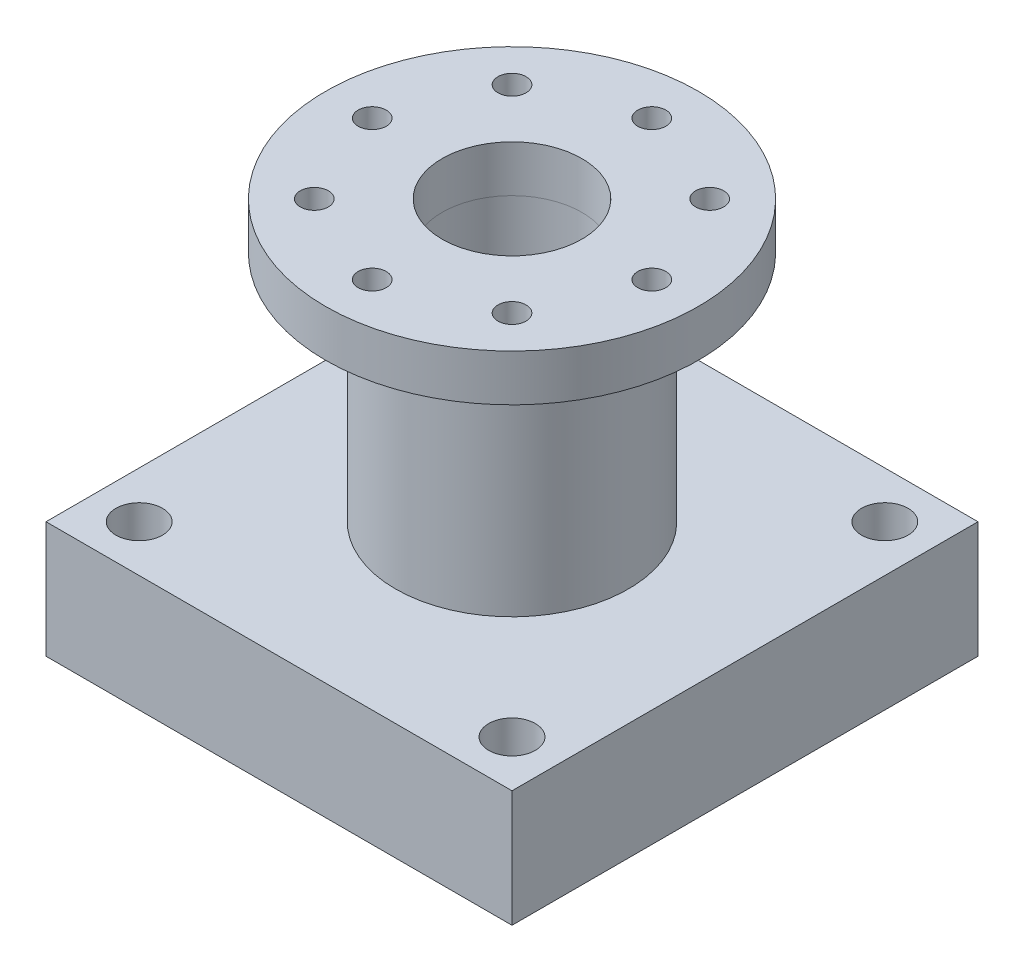
ISO-10303-21;
HEADER;
FILE_DESCRIPTION(('STEP AP214'),'2;1');
FILE_NAME('part.step','',(''),(''),'','','');
FILE_SCHEMA(('AUTOMOTIVE_DESIGN { 1 0 10303 214 1 1 1 1 }'));
ENDSEC;
DATA;
#1=APPLICATION_CONTEXT('core data for automotive mechanical design processes');
#2=APPLICATION_PROTOCOL_DEFINITION('international standard','automotive_design',2000,#1);
#3=PRODUCT_CONTEXT('',#1,'mechanical');
#4=PRODUCT('Part','Part','',(#3));
#5=PRODUCT_RELATED_PRODUCT_CATEGORY('part','',(#4));
#6=PRODUCT_DEFINITION_FORMATION('','',#4);
#7=PRODUCT_DEFINITION_CONTEXT('part definition',#1,'design');
#8=PRODUCT_DEFINITION('design','',#6,#7);
#9=PRODUCT_DEFINITION_SHAPE('','',#8);
#10=(LENGTH_UNIT() NAMED_UNIT(*) SI_UNIT(.MILLI.,.METRE.));
#11=(NAMED_UNIT(*) PLANE_ANGLE_UNIT() SI_UNIT($,.RADIAN.));
#12=(NAMED_UNIT(*) SI_UNIT($,.STERADIAN.) SOLID_ANGLE_UNIT());
#13=UNCERTAINTY_MEASURE_WITH_UNIT(LENGTH_MEASURE(1.E-05),#10,'distance_accuracy_value','');
#14=(GEOMETRIC_REPRESENTATION_CONTEXT(3) GLOBAL_UNCERTAINTY_ASSIGNED_CONTEXT((#13)) GLOBAL_UNIT_ASSIGNED_CONTEXT((#10,
#11,#12)) REPRESENTATION_CONTEXT('',''));
#15=CARTESIAN_POINT('',(0.,0.,0.));
#16=DIRECTION('',(0.,0.,1.));
#17=DIRECTION('',(1.,0.,0.));
#18=AXIS2_PLACEMENT_3D('',#15,#16,#17);
#19=CARTESIAN_POINT('',(0.,60.,0.));
#20=DIRECTION('',(0.,1.,0.));
#21=DIRECTION('',(0.,0.,1.));
#22=AXIS2_PLACEMENT_3D('',#19,#20,#21);
#23=PLANE('',#22);
#24=CARTESIAN_POINT('',(-21.2132034355962,60.,-21.2132034355967));
#25=DIRECTION('',(0.,1.,0.));
#26=DIRECTION('',(0.707106781186539,0.,0.707106781186556));
#27=AXIS2_PLACEMENT_3D('',#24,#25,#26);
#28=CIRCLE('',#27,3.01435233277966);
#29=CARTESIAN_POINT('',(-19.0817344602022,60.,-19.0817344602027));
#30=VERTEX_POINT('',#29);
#31=EDGE_CURVE('E103',#30,#30,#28,.T.);
#32=ORIENTED_EDGE('',*,*,#31,.F.);
#33=EDGE_LOOP('',(#32));
#34=FACE_BOUND('',#33,.T.);
#35=CARTESIAN_POINT('',(-30.,60.,-3.14233320495882E-13));
#36=DIRECTION('',(0.,1.,0.));
#37=DIRECTION('',(1.,0.,0.));
#38=AXIS2_PLACEMENT_3D('',#35,#36,#37);
#39=CIRCLE('',#38,3.01435233277966);
#40=CARTESIAN_POINT('',(-26.9856476672203,60.,-2.82659655740087E-13));
#41=VERTEX_POINT('',#40);
#42=EDGE_CURVE('E97',#41,#41,#39,.T.);
#43=ORIENTED_EDGE('',*,*,#42,.F.);
#44=EDGE_LOOP('',(#43));
#45=FACE_BOUND('',#44,.T.);
#46=CARTESIAN_POINT('',(-21.2132034355966,60.,21.2132034355962));
#47=DIRECTION('',(0.,1.,0.));
#48=DIRECTION('',(0.707106781186554,0.,-0.707106781186541));
#49=AXIS2_PLACEMENT_3D('',#46,#47,#48);
#50=CIRCLE('',#49,3.01435233277966);
#51=CARTESIAN_POINT('',(-19.0817344602026,60.,19.0817344602023));
#52=VERTEX_POINT('',#51);
#53=EDGE_CURVE('E91',#52,#52,#50,.T.);
#54=ORIENTED_EDGE('',*,*,#53,.F.);
#55=EDGE_LOOP('',(#54));
#56=FACE_BOUND('',#55,.T.);
#57=CARTESIAN_POINT('',(0.,60.,30.));
#58=DIRECTION('',(0.,1.,0.));
#59=DIRECTION('',(0.,0.,-1.));
#60=AXIS2_PLACEMENT_3D('',#57,#58,#59);
#61=CIRCLE('',#60,3.01435233277966);
#62=CARTESIAN_POINT('',(0.,60.,26.9856476672203));
#63=VERTEX_POINT('',#62);
#64=EDGE_CURVE('E85',#63,#63,#61,.T.);
#65=ORIENTED_EDGE('',*,*,#64,.F.);
#66=EDGE_LOOP('',(#65));
#67=FACE_BOUND('',#66,.T.);
#68=CARTESIAN_POINT('',(21.2132034355963,60.,21.2132034355965));
#69=DIRECTION('',(0.,1.,0.));
#70=DIRECTION('',(-0.707106781186544,0.,-0.707106781186551));
#71=AXIS2_PLACEMENT_3D('',#68,#69,#70);
#72=CIRCLE('',#71,3.01435233277966);
#73=CARTESIAN_POINT('',(19.0817344602023,60.,19.0817344602025));
#74=VERTEX_POINT('',#73);
#75=EDGE_CURVE('E79',#74,#74,#72,.T.);
#76=ORIENTED_EDGE('',*,*,#75,.F.);
#77=EDGE_LOOP('',(#76));
#78=FACE_BOUND('',#77,.T.);
#79=CARTESIAN_POINT('',(30.,60.,1.04744440165294E-13));
#80=DIRECTION('',(0.,1.,0.));
#81=DIRECTION('',(-1.,0.,0.));
#82=AXIS2_PLACEMENT_3D('',#79,#80,#81);
#83=CIRCLE('',#82,3.01435233277966);
#84=CARTESIAN_POINT('',(26.9856476672203,60.,0.));
#85=VERTEX_POINT('',#84);
#86=EDGE_CURVE('E73',#85,#85,#83,.T.);
#87=ORIENTED_EDGE('',*,*,#86,.F.);
#88=EDGE_LOOP('',(#87));
#89=FACE_BOUND('',#88,.T.);
#90=CARTESIAN_POINT('',(21.2132034355965,60.,-21.2132034355964));
#91=DIRECTION('',(0.,1.,0.));
#92=DIRECTION('',(-0.707106781186549,0.,0.707106781186546));
#93=AXIS2_PLACEMENT_3D('',#90,#91,#92);
#94=CIRCLE('',#93,3.01435233277966);
#95=CARTESIAN_POINT('',(19.0817344602025,60.,-19.0817344602024));
#96=VERTEX_POINT('',#95);
#97=EDGE_CURVE('E67',#96,#96,#94,.T.);
#98=ORIENTED_EDGE('',*,*,#97,.F.);
#99=EDGE_LOOP('',(#98));
#100=FACE_BOUND('',#99,.T.);
#101=CARTESIAN_POINT('',(0.,60.,-30.));
#102=DIRECTION('',(0.,1.,0.));
#103=DIRECTION('',(0.,0.,1.));
#104=AXIS2_PLACEMENT_3D('',#101,#102,#103);
#105=CIRCLE('',#104,3.01435233277966);
#106=CARTESIAN_POINT('',(0.,60.,-26.9856476672203));
#107=VERTEX_POINT('',#106);
#108=EDGE_CURVE('E61',#107,#107,#105,.T.);
#109=ORIENTED_EDGE('',*,*,#108,.F.);
#110=EDGE_LOOP('',(#109));
#111=FACE_BOUND('',#110,.T.);
#112=CARTESIAN_POINT('',(0.,60.,0.));
#113=DIRECTION('',(0.,1.,0.));
#114=DIRECTION('',(0.,0.,1.));
#115=AXIS2_PLACEMENT_3D('',#112,#113,#114);
#116=CIRCLE('',#115,40.);
#117=CARTESIAN_POINT('',(0.,60.,40.));
#118=VERTEX_POINT('',#117);
#119=EDGE_CURVE('E11',#118,#118,#116,.T.);
#120=ORIENTED_EDGE('',*,*,#119,.T.);
#121=EDGE_LOOP('',(#120));
#122=FACE_BOUND('',#121,.T.);
#123=CARTESIAN_POINT('',(0.,60.,0.));
#124=DIRECTION('',(0.,1.,0.));
#125=DIRECTION('',(0.,0.,1.));
#126=AXIS2_PLACEMENT_3D('',#123,#124,#125);
#127=CIRCLE('',#126,15.);
#128=CARTESIAN_POINT('',(0.,60.,15.));
#129=VERTEX_POINT('',#128);
#130=EDGE_CURVE('E51',#129,#129,#127,.T.);
#131=ORIENTED_EDGE('',*,*,#130,.F.);
#132=EDGE_LOOP('',(#131));
#133=FACE_BOUND('',#132,.T.);
#134=ADVANCED_FACE('F40',(#34,#45,#56,#67,#78,#89,#100,#111,#122,#133),#23,.T.);
#135=CARTESIAN_POINT('',(0.,50.,0.));
#136=DIRECTION('',(0.,1.,0.));
#137=DIRECTION('',(0.,0.,1.));
#138=AXIS2_PLACEMENT_3D('',#135,#136,#137);
#139=PLANE('',#138);
#140=CARTESIAN_POINT('',(-21.2132034355962,50.,-21.2132034355967));
#141=DIRECTION('',(0.,1.,0.));
#142=DIRECTION('',(0.,0.,1.));
#143=AXIS2_PLACEMENT_3D('',#140,#141,#142);
#144=CIRCLE('',#143,3.01435233277966);
#145=CARTESIAN_POINT('',(-21.2132034355962,50.,-18.198851102817));
#146=VERTEX_POINT('',#145);
#147=EDGE_CURVE('E100',#146,#146,#144,.F.);
#148=ORIENTED_EDGE('',*,*,#147,.F.);
#149=EDGE_LOOP('',(#148));
#150=FACE_BOUND('',#149,.T.);
#151=CARTESIAN_POINT('',(-30.,50.,-3.14233320495882E-13));
#152=DIRECTION('',(0.,1.,0.));
#153=DIRECTION('',(0.,0.,1.));
#154=AXIS2_PLACEMENT_3D('',#151,#152,#153);
#155=CIRCLE('',#154,3.01435233277966);
#156=CARTESIAN_POINT('',(-30.,50.,3.01435233277935));
#157=VERTEX_POINT('',#156);
#158=EDGE_CURVE('E94',#157,#157,#155,.F.);
#159=ORIENTED_EDGE('',*,*,#158,.F.);
#160=EDGE_LOOP('',(#159));
#161=FACE_BOUND('',#160,.T.);
#162=CARTESIAN_POINT('',(-21.2132034355966,50.,21.2132034355962));
#163=DIRECTION('',(0.,1.,0.));
#164=DIRECTION('',(0.,0.,1.));
#165=AXIS2_PLACEMENT_3D('',#162,#163,#164);
#166=CIRCLE('',#165,3.01435233277966);
#167=CARTESIAN_POINT('',(-21.2132034355966,50.,24.2275557683759));
#168=VERTEX_POINT('',#167);
#169=EDGE_CURVE('E88',#168,#168,#166,.F.);
#170=ORIENTED_EDGE('',*,*,#169,.F.);
#171=EDGE_LOOP('',(#170));
#172=FACE_BOUND('',#171,.T.);
#173=CARTESIAN_POINT('',(0.,50.,30.));
#174=DIRECTION('',(0.,1.,0.));
#175=DIRECTION('',(0.,0.,1.));
#176=AXIS2_PLACEMENT_3D('',#173,#174,#175);
#177=CIRCLE('',#176,3.01435233277966);
#178=CARTESIAN_POINT('',(0.,50.,33.0143523327797));
#179=VERTEX_POINT('',#178);
#180=EDGE_CURVE('E82',#179,#179,#177,.F.);
#181=ORIENTED_EDGE('',*,*,#180,.F.);
#182=EDGE_LOOP('',(#181));
#183=FACE_BOUND('',#182,.T.);
#184=CARTESIAN_POINT('',(21.2132034355963,50.,21.2132034355965));
#185=DIRECTION('',(0.,1.,0.));
#186=DIRECTION('',(0.,0.,1.));
#187=AXIS2_PLACEMENT_3D('',#184,#185,#186);
#188=CIRCLE('',#187,3.01435233277966);
#189=CARTESIAN_POINT('',(21.2132034355963,50.,24.2275557683762));
#190=VERTEX_POINT('',#189);
#191=EDGE_CURVE('E76',#190,#190,#188,.F.);
#192=ORIENTED_EDGE('',*,*,#191,.F.);
#193=EDGE_LOOP('',(#192));
#194=FACE_BOUND('',#193,.T.);
#195=CARTESIAN_POINT('',(30.,50.,1.04744440165294E-13));
#196=DIRECTION('',(0.,1.,0.));
#197=DIRECTION('',(0.,0.,1.));
#198=AXIS2_PLACEMENT_3D('',#195,#196,#197);
#199=CIRCLE('',#198,3.01435233277966);
#200=CARTESIAN_POINT('',(30.,50.,3.01435233277976));
#201=VERTEX_POINT('',#200);
#202=EDGE_CURVE('E70',#201,#201,#199,.F.);
#203=ORIENTED_EDGE('',*,*,#202,.F.);
#204=EDGE_LOOP('',(#203));
#205=FACE_BOUND('',#204,.T.);
#206=CARTESIAN_POINT('',(21.2132034355965,50.,-21.2132034355964));
#207=DIRECTION('',(0.,1.,0.));
#208=DIRECTION('',(0.,0.,1.));
#209=AXIS2_PLACEMENT_3D('',#206,#207,#208);
#210=CIRCLE('',#209,3.01435233277966);
#211=CARTESIAN_POINT('',(21.2132034355965,50.,-18.1988511028167));
#212=VERTEX_POINT('',#211);
#213=EDGE_CURVE('E64',#212,#212,#210,.F.);
#214=ORIENTED_EDGE('',*,*,#213,.F.);
#215=EDGE_LOOP('',(#214));
#216=FACE_BOUND('',#215,.T.);
#217=CARTESIAN_POINT('',(0.,50.,-30.));
#218=DIRECTION('',(0.,1.,0.));
#219=DIRECTION('',(0.,0.,1.));
#220=AXIS2_PLACEMENT_3D('',#217,#218,#219);
#221=CIRCLE('',#220,3.01435233277966);
#222=CARTESIAN_POINT('',(0.,50.,-26.9856476672203));
#223=VERTEX_POINT('',#222);
#224=EDGE_CURVE('E56',#223,#223,#221,.F.);
#225=ORIENTED_EDGE('',*,*,#224,.F.);
#226=EDGE_LOOP('',(#225));
#227=FACE_BOUND('',#226,.T.);
#228=CARTESIAN_POINT('',(0.,50.,0.));
#229=DIRECTION('',(0.,1.,0.));
#230=DIRECTION('',(0.,0.,1.));
#231=AXIS2_PLACEMENT_3D('',#228,#229,#230);
#232=CIRCLE('',#231,40.);
#233=CARTESIAN_POINT('',(0.,50.,40.));
#234=VERTEX_POINT('',#233);
#235=EDGE_CURVE('E44',#234,#234,#232,.T.);
#236=ORIENTED_EDGE('',*,*,#235,.F.);
#237=EDGE_LOOP('',(#236));
#238=FACE_BOUND('',#237,.T.);
#239=CARTESIAN_POINT('',(0.,50.,0.));
#240=DIRECTION('',(0.,1.,0.));
#241=DIRECTION('',(0.,0.,1.));
#242=AXIS2_PLACEMENT_3D('',#239,#240,#241);
#243=CIRCLE('',#242,15.);
#244=CARTESIAN_POINT('',(0.,50.,15.));
#245=VERTEX_POINT('',#244);
#246=EDGE_CURVE('E53',#245,#245,#243,.T.);
#247=ORIENTED_EDGE('',*,*,#246,.T.);
#248=EDGE_LOOP('',(#247));
#249=FACE_BOUND('',#248,.T.);
#250=ADVANCED_FACE('F112',(#150,#161,#172,#183,#194,#205,#216,#227,#238,#249),#139,.F.);
#251=CARTESIAN_POINT('',(0.,60.,0.));
#252=DIRECTION('',(0.,-1.,0.));
#253=DIRECTION('',(0.,0.,-1.));
#254=AXIS2_PLACEMENT_3D('',#251,#252,#253);
#255=CYLINDRICAL_SURFACE('',#254,40.);
#256=ORIENTED_EDGE('',*,*,#119,.F.);
#257=EDGE_LOOP('',(#256));
#258=FACE_BOUND('',#257,.T.);
#259=ORIENTED_EDGE('',*,*,#235,.T.);
#260=EDGE_LOOP('',(#259));
#261=FACE_BOUND('',#260,.T.);
#262=ADVANCED_FACE('F42',(#258,#261),#255,.T.);
#263=CARTESIAN_POINT('',(0.,60.,0.));
#264=DIRECTION('',(0.,-1.,0.));
#265=DIRECTION('',(0.,0.,-1.));
#266=AXIS2_PLACEMENT_3D('',#263,#264,#265);
#267=CYLINDRICAL_SURFACE('',#266,15.);
#268=ORIENTED_EDGE('',*,*,#130,.T.);
#269=EDGE_LOOP('',(#268));
#270=FACE_BOUND('',#269,.T.);
#271=ORIENTED_EDGE('',*,*,#246,.F.);
#272=EDGE_LOOP('',(#271));
#273=FACE_BOUND('',#272,.T.);
#274=ADVANCED_FACE('F130',(#270,#273),#267,.F.);
#275=CARTESIAN_POINT('',(0.,-25.001,-30.));
#276=DIRECTION('',(0.,1.,0.));
#277=DIRECTION('',(0.,0.,1.));
#278=AXIS2_PLACEMENT_3D('',#275,#276,#277);
#279=CYLINDRICAL_SURFACE('',#278,3.01435233277966);
#280=ORIENTED_EDGE('',*,*,#108,.T.);
#281=EDGE_LOOP('',(#280));
#282=FACE_BOUND('',#281,.T.);
#283=ORIENTED_EDGE('',*,*,#224,.T.);
#284=EDGE_LOOP('',(#283));
#285=FACE_BOUND('',#284,.T.);
#286=ADVANCED_FACE('F133',(#282,#285),#279,.F.);
#287=CARTESIAN_POINT('',(21.2132034355965,49.999,-21.2132034355964));
#288=DIRECTION('',(0.,1.,0.));
#289=DIRECTION('',(0.,0.,1.));
#290=AXIS2_PLACEMENT_3D('',#287,#288,#289);
#291=CYLINDRICAL_SURFACE('',#290,3.01435233277966);
#292=ORIENTED_EDGE('',*,*,#97,.T.);
#293=EDGE_LOOP('',(#292));
#294=FACE_BOUND('',#293,.T.);
#295=ORIENTED_EDGE('',*,*,#213,.T.);
#296=EDGE_LOOP('',(#295));
#297=FACE_BOUND('',#296,.T.);
#298=ADVANCED_FACE('F148',(#294,#297),#291,.F.);
#299=CARTESIAN_POINT('',(30.,49.999,1.04744440165294E-13));
#300=DIRECTION('',(0.,1.,0.));
#301=DIRECTION('',(0.,0.,1.));
#302=AXIS2_PLACEMENT_3D('',#299,#300,#301);
#303=CYLINDRICAL_SURFACE('',#302,3.01435233277966);
#304=ORIENTED_EDGE('',*,*,#86,.T.);
#305=EDGE_LOOP('',(#304));
#306=FACE_BOUND('',#305,.T.);
#307=ORIENTED_EDGE('',*,*,#202,.T.);
#308=EDGE_LOOP('',(#307));
#309=FACE_BOUND('',#308,.T.);
#310=ADVANCED_FACE('F152',(#306,#309),#303,.F.);
#311=CARTESIAN_POINT('',(21.2132034355963,49.999,21.2132034355965));
#312=DIRECTION('',(0.,1.,0.));
#313=DIRECTION('',(0.,0.,1.));
#314=AXIS2_PLACEMENT_3D('',#311,#312,#313);
#315=CYLINDRICAL_SURFACE('',#314,3.01435233277966);
#316=ORIENTED_EDGE('',*,*,#75,.T.);
#317=EDGE_LOOP('',(#316));
#318=FACE_BOUND('',#317,.T.);
#319=ORIENTED_EDGE('',*,*,#191,.T.);
#320=EDGE_LOOP('',(#319));
#321=FACE_BOUND('',#320,.T.);
#322=ADVANCED_FACE('F156',(#318,#321),#315,.F.);
#323=CARTESIAN_POINT('',(0.,49.999,30.));
#324=DIRECTION('',(0.,1.,0.));
#325=DIRECTION('',(0.,0.,1.));
#326=AXIS2_PLACEMENT_3D('',#323,#324,#325);
#327=CYLINDRICAL_SURFACE('',#326,3.01435233277966);
#328=ORIENTED_EDGE('',*,*,#64,.T.);
#329=EDGE_LOOP('',(#328));
#330=FACE_BOUND('',#329,.T.);
#331=ORIENTED_EDGE('',*,*,#180,.T.);
#332=EDGE_LOOP('',(#331));
#333=FACE_BOUND('',#332,.T.);
#334=ADVANCED_FACE('F160',(#330,#333),#327,.F.);
#335=CARTESIAN_POINT('',(-21.2132034355966,49.999,21.2132034355962));
#336=DIRECTION('',(0.,1.,0.));
#337=DIRECTION('',(0.,0.,1.));
#338=AXIS2_PLACEMENT_3D('',#335,#336,#337);
#339=CYLINDRICAL_SURFACE('',#338,3.01435233277966);
#340=ORIENTED_EDGE('',*,*,#53,.T.);
#341=EDGE_LOOP('',(#340));
#342=FACE_BOUND('',#341,.T.);
#343=ORIENTED_EDGE('',*,*,#169,.T.);
#344=EDGE_LOOP('',(#343));
#345=FACE_BOUND('',#344,.T.);
#346=ADVANCED_FACE('F164',(#342,#345),#339,.F.);
#347=CARTESIAN_POINT('',(-30.,49.999,-3.14233320495882E-13));
#348=DIRECTION('',(0.,1.,0.));
#349=DIRECTION('',(0.,0.,1.));
#350=AXIS2_PLACEMENT_3D('',#347,#348,#349);
#351=CYLINDRICAL_SURFACE('',#350,3.01435233277966);
#352=ORIENTED_EDGE('',*,*,#42,.T.);
#353=EDGE_LOOP('',(#352));
#354=FACE_BOUND('',#353,.T.);
#355=ORIENTED_EDGE('',*,*,#158,.T.);
#356=EDGE_LOOP('',(#355));
#357=FACE_BOUND('',#356,.T.);
#358=ADVANCED_FACE('F168',(#354,#357),#351,.F.);
#359=CARTESIAN_POINT('',(-21.2132034355962,49.999,-21.2132034355967));
#360=DIRECTION('',(0.,1.,0.));
#361=DIRECTION('',(0.,0.,1.));
#362=AXIS2_PLACEMENT_3D('',#359,#360,#361);
#363=CYLINDRICAL_SURFACE('',#362,3.01435233277966);
#364=ORIENTED_EDGE('',*,*,#31,.T.);
#365=EDGE_LOOP('',(#364));
#366=FACE_BOUND('',#365,.T.);
#367=ORIENTED_EDGE('',*,*,#147,.T.);
#368=EDGE_LOOP('',(#367));
#369=FACE_BOUND('',#368,.T.);
#370=ADVANCED_FACE('F107',(#366,#369),#363,.F.);
#371=CLOSED_SHELL('',(#134,#250,#262,#274,#286,#298,#310,#322,#334,#346,#358,#370));
#372=MANIFOLD_SOLID_BREP('B2',#371);
#373=CARTESIAN_POINT('',(0.,0.,0.));
#374=DIRECTION('',(0.,-1.,0.));
#375=DIRECTION('',(0.,0.,-1.));
#376=AXIS2_PLACEMENT_3D('',#373,#374,#375);
#377=PLANE('',#376);
#378=CARTESIAN_POINT('',(40.,0.,-40.));
#379=DIRECTION('',(0.,-1.,0.));
#380=DIRECTION('',(0.,0.,-1.));
#381=AXIS2_PLACEMENT_3D('',#378,#379,#380);
#382=CIRCLE('',#381,5.);
#383=CARTESIAN_POINT('',(40.,0.,-45.));
#384=VERTEX_POINT('',#383);
#385=EDGE_CURVE('E438',#384,#384,#382,.F.);
#386=ORIENTED_EDGE('',*,*,#385,.F.);
#387=EDGE_LOOP('',(#386));
#388=FACE_BOUND('',#387,.T.);
#389=CARTESIAN_POINT('',(-40.,0.,-40.));
#390=DIRECTION('',(0.,-1.,0.));
#391=DIRECTION('',(0.,0.,-1.));
#392=AXIS2_PLACEMENT_3D('',#389,#390,#391);
#393=CIRCLE('',#392,5.);
#394=CARTESIAN_POINT('',(-40.,0.,-45.));
#395=VERTEX_POINT('',#394);
#396=EDGE_CURVE('E434',#395,#395,#393,.F.);
#397=ORIENTED_EDGE('',*,*,#396,.F.);
#398=EDGE_LOOP('',(#397));
#399=FACE_BOUND('',#398,.T.);
#400=CARTESIAN_POINT('',(40.,0.,40.));
#401=DIRECTION('',(0.,-1.,0.));
#402=DIRECTION('',(0.,0.,-1.));
#403=AXIS2_PLACEMENT_3D('',#400,#401,#402);
#404=CIRCLE('',#403,5.);
#405=CARTESIAN_POINT('',(40.,0.,35.));
#406=VERTEX_POINT('',#405);
#407=EDGE_CURVE('E428',#406,#406,#404,.F.);
#408=ORIENTED_EDGE('',*,*,#407,.F.);
#409=EDGE_LOOP('',(#408));
#410=FACE_BOUND('',#409,.T.);
#411=CARTESIAN_POINT('',(-40.,0.,40.));
#412=DIRECTION('',(0.,-1.,0.));
#413=DIRECTION('',(0.,0.,-1.));
#414=AXIS2_PLACEMENT_3D('',#411,#412,#413);
#415=CIRCLE('',#414,5.);
#416=CARTESIAN_POINT('',(-40.,0.,35.));
#417=VERTEX_POINT('',#416);
#418=EDGE_CURVE('E388',#417,#417,#415,.F.);
#419=ORIENTED_EDGE('',*,*,#418,.F.);
#420=EDGE_LOOP('',(#419));
#421=FACE_BOUND('',#420,.T.);
#422=DIRECTION('',(0.,0.,-1.));
#423=VECTOR('',#422,1.);
#424=CARTESIAN_POINT('',(50.,0.,50.));
#425=LINE('',#424,#423);
#426=CARTESIAN_POINT('',(50.,0.,50.));
#427=VERTEX_POINT('',#426);
#428=CARTESIAN_POINT('',(50.,0.,-50.));
#429=VERTEX_POINT('',#428);
#430=EDGE_CURVE('E338',#427,#429,#425,.T.);
#431=ORIENTED_EDGE('',*,*,#430,.T.);
#432=DIRECTION('',(-1.,0.,0.));
#433=VECTOR('',#432,1.);
#434=CARTESIAN_POINT('',(-50.,0.,-50.));
#435=LINE('',#434,#433);
#436=CARTESIAN_POINT('',(-50.,0.,-50.));
#437=VERTEX_POINT('',#436);
#438=EDGE_CURVE('E341',#429,#437,#435,.T.);
#439=ORIENTED_EDGE('',*,*,#438,.T.);
#440=DIRECTION('',(0.,0.,1.));
#441=VECTOR('',#440,1.);
#442=CARTESIAN_POINT('',(-50.,0.,50.));
#443=LINE('',#442,#441);
#444=CARTESIAN_POINT('',(-50.,0.,50.));
#445=VERTEX_POINT('',#444);
#446=EDGE_CURVE('E322',#437,#445,#443,.T.);
#447=ORIENTED_EDGE('',*,*,#446,.T.);
#448=DIRECTION('',(1.,0.,0.));
#449=VECTOR('',#448,1.);
#450=CARTESIAN_POINT('',(-50.,0.,50.));
#451=LINE('',#450,#449);
#452=EDGE_CURVE('E333',#445,#427,#451,.T.);
#453=ORIENTED_EDGE('',*,*,#452,.T.);
#454=EDGE_LOOP('',(#431,#439,#447,#453));
#455=FACE_BOUND('',#454,.T.);
#456=CARTESIAN_POINT('',(0.,0.,0.));
#457=DIRECTION('',(0.,-1.,0.));
#458=DIRECTION('',(0.,0.,-1.));
#459=AXIS2_PLACEMENT_3D('',#456,#457,#458);
#460=CIRCLE('',#459,25.);
#461=CARTESIAN_POINT('',(0.,0.,-25.));
#462=VERTEX_POINT('',#461);
#463=EDGE_CURVE('E38',#462,#462,#460,.F.);
#464=ORIENTED_EDGE('',*,*,#463,.F.);
#465=EDGE_LOOP('',(#464));
#466=FACE_BOUND('',#465,.T.);
#467=ADVANCED_FACE('F270',(#388,#399,#410,#421,#455,#466),#377,.F.);
#468=CARTESIAN_POINT('',(50.,-25.,50.));
#469=DIRECTION('',(1.,0.,0.));
#470=DIRECTION('',(0.,0.,-1.));
#471=AXIS2_PLACEMENT_3D('',#468,#469,#470);
#472=PLANE('',#471);
#473=ORIENTED_EDGE('',*,*,#430,.F.);
#474=DIRECTION('',(0.,1.,0.));
#475=VECTOR('',#474,1.);
#476=CARTESIAN_POINT('',(50.,-25.,50.));
#477=LINE('',#476,#475);
#478=CARTESIAN_POINT('',(50.,-25.,50.));
#479=VERTEX_POINT('',#478);
#480=EDGE_CURVE('E279',#479,#427,#477,.T.);
#481=ORIENTED_EDGE('',*,*,#480,.F.);
#482=DIRECTION('',(0.,0.,-1.));
#483=VECTOR('',#482,1.);
#484=CARTESIAN_POINT('',(50.,-25.,50.));
#485=LINE('',#484,#483);
#486=CARTESIAN_POINT('',(50.,-25.,-50.));
#487=VERTEX_POINT('',#486);
#488=EDGE_CURVE('E331',#479,#487,#485,.T.);
#489=ORIENTED_EDGE('',*,*,#488,.T.);
#490=DIRECTION('',(0.,1.,0.));
#491=VECTOR('',#490,1.);
#492=CARTESIAN_POINT('',(50.,-25.,-50.));
#493=LINE('',#492,#491);
#494=EDGE_CURVE('E314',#487,#429,#493,.T.);
#495=ORIENTED_EDGE('',*,*,#494,.T.);
#496=EDGE_LOOP('',(#473,#481,#489,#495));
#497=FACE_BOUND('',#496,.T.);
#498=ADVANCED_FACE('F272',(#497),#472,.T.);
#499=CARTESIAN_POINT('',(-50.,-25.,50.));
#500=DIRECTION('',(0.,0.,1.));
#501=DIRECTION('',(1.,0.,0.));
#502=AXIS2_PLACEMENT_3D('',#499,#500,#501);
#503=PLANE('',#502);
#504=ORIENTED_EDGE('',*,*,#452,.F.);
#505=DIRECTION('',(0.,1.,0.));
#506=VECTOR('',#505,1.);
#507=CARTESIAN_POINT('',(-50.,-25.,50.));
#508=LINE('',#507,#506);
#509=CARTESIAN_POINT('',(-50.,-25.,50.));
#510=VERTEX_POINT('',#509);
#511=EDGE_CURVE('E303',#510,#445,#508,.T.);
#512=ORIENTED_EDGE('',*,*,#511,.F.);
#513=DIRECTION('',(1.,0.,0.));
#514=VECTOR('',#513,1.);
#515=CARTESIAN_POINT('',(-50.,-25.,50.));
#516=LINE('',#515,#514);
#517=EDGE_CURVE('E328',#510,#479,#516,.T.);
#518=ORIENTED_EDGE('',*,*,#517,.T.);
#519=ORIENTED_EDGE('',*,*,#480,.T.);
#520=EDGE_LOOP('',(#504,#512,#518,#519));
#521=FACE_BOUND('',#520,.T.);
#522=ADVANCED_FACE('F350',(#521),#503,.T.);
#523=CARTESIAN_POINT('',(-50.,-25.,50.));
#524=DIRECTION('',(-1.,0.,0.));
#525=DIRECTION('',(0.,0.,1.));
#526=AXIS2_PLACEMENT_3D('',#523,#524,#525);
#527=PLANE('',#526);
#528=ORIENTED_EDGE('',*,*,#446,.F.);
#529=DIRECTION('',(0.,1.,0.));
#530=VECTOR('',#529,1.);
#531=CARTESIAN_POINT('',(-50.,-25.,-50.));
#532=LINE('',#531,#530);
#533=CARTESIAN_POINT('',(-50.,-25.,-50.));
#534=VERTEX_POINT('',#533);
#535=EDGE_CURVE('E317',#534,#437,#532,.T.);
#536=ORIENTED_EDGE('',*,*,#535,.F.);
#537=DIRECTION('',(0.,0.,1.));
#538=VECTOR('',#537,1.);
#539=CARTESIAN_POINT('',(-50.,-25.,50.));
#540=LINE('',#539,#538);
#541=EDGE_CURVE('E320',#534,#510,#540,.T.);
#542=ORIENTED_EDGE('',*,*,#541,.T.);
#543=ORIENTED_EDGE('',*,*,#511,.T.);
#544=EDGE_LOOP('',(#528,#536,#542,#543));
#545=FACE_BOUND('',#544,.T.);
#546=ADVANCED_FACE('F319',(#545),#527,.T.);
#547=CARTESIAN_POINT('',(-50.,-25.,-50.));
#548=DIRECTION('',(0.,0.,-1.));
#549=DIRECTION('',(-1.,0.,0.));
#550=AXIS2_PLACEMENT_3D('',#547,#548,#549);
#551=PLANE('',#550);
#552=ORIENTED_EDGE('',*,*,#438,.F.);
#553=ORIENTED_EDGE('',*,*,#494,.F.);
#554=DIRECTION('',(-1.,0.,0.));
#555=VECTOR('',#554,1.);
#556=CARTESIAN_POINT('',(-50.,-25.,-50.));
#557=LINE('',#556,#555);
#558=EDGE_CURVE('E327',#487,#534,#557,.T.);
#559=ORIENTED_EDGE('',*,*,#558,.T.);
#560=ORIENTED_EDGE('',*,*,#535,.T.);
#561=EDGE_LOOP('',(#552,#553,#559,#560));
#562=FACE_BOUND('',#561,.T.);
#563=ADVANCED_FACE('F330',(#562),#551,.T.);
#564=CARTESIAN_POINT('',(0.,-25.,0.));
#565=DIRECTION('',(0.,-1.,0.));
#566=DIRECTION('',(0.,0.,-1.));
#567=AXIS2_PLACEMENT_3D('',#564,#565,#566);
#568=PLANE('',#567);
#569=CARTESIAN_POINT('',(40.,-25.,-40.));
#570=DIRECTION('',(0.,-1.,0.));
#571=DIRECTION('',(0.,0.,-1.));
#572=AXIS2_PLACEMENT_3D('',#569,#570,#571);
#573=CIRCLE('',#572,5.);
#574=CARTESIAN_POINT('',(40.,-25.,-45.));
#575=VERTEX_POINT('',#574);
#576=EDGE_CURVE('E417',#575,#575,#573,.T.);
#577=ORIENTED_EDGE('',*,*,#576,.F.);
#578=EDGE_LOOP('',(#577));
#579=FACE_BOUND('',#578,.T.);
#580=CARTESIAN_POINT('',(-40.,-25.,-40.));
#581=DIRECTION('',(0.,-1.,0.));
#582=DIRECTION('',(0.,0.,-1.));
#583=AXIS2_PLACEMENT_3D('',#580,#581,#582);
#584=CIRCLE('',#583,5.);
#585=CARTESIAN_POINT('',(-40.,-25.,-45.));
#586=VERTEX_POINT('',#585);
#587=EDGE_CURVE('E421',#586,#586,#584,.T.);
#588=ORIENTED_EDGE('',*,*,#587,.F.);
#589=EDGE_LOOP('',(#588));
#590=FACE_BOUND('',#589,.T.);
#591=CARTESIAN_POINT('',(40.,-25.,40.));
#592=DIRECTION('',(0.,-1.,0.));
#593=DIRECTION('',(0.,0.,-1.));
#594=AXIS2_PLACEMENT_3D('',#591,#592,#593);
#595=CIRCLE('',#594,5.);
#596=CARTESIAN_POINT('',(40.,-25.,35.));
#597=VERTEX_POINT('',#596);
#598=EDGE_CURVE('E425',#597,#597,#595,.T.);
#599=ORIENTED_EDGE('',*,*,#598,.F.);
#600=EDGE_LOOP('',(#599));
#601=FACE_BOUND('',#600,.T.);
#602=CARTESIAN_POINT('',(-40.,-25.,40.));
#603=DIRECTION('',(0.,-1.,0.));
#604=DIRECTION('',(0.,0.,-1.));
#605=AXIS2_PLACEMENT_3D('',#602,#603,#604);
#606=CIRCLE('',#605,5.);
#607=CARTESIAN_POINT('',(-40.,-25.,35.));
#608=VERTEX_POINT('',#607);
#609=EDGE_CURVE('E393',#608,#608,#606,.T.);
#610=ORIENTED_EDGE('',*,*,#609,.F.);
#611=EDGE_LOOP('',(#610));
#612=FACE_BOUND('',#611,.T.);
#613=ORIENTED_EDGE('',*,*,#488,.F.);
#614=ORIENTED_EDGE('',*,*,#517,.F.);
#615=ORIENTED_EDGE('',*,*,#541,.F.);
#616=ORIENTED_EDGE('',*,*,#558,.F.);
#617=EDGE_LOOP('',(#613,#614,#615,#616));
#618=FACE_BOUND('',#617,.T.);
#619=ADVANCED_FACE('F326',(#579,#590,#601,#612,#618),#568,.T.);
#620=CARTESIAN_POINT('',(0.,50.,0.));
#621=DIRECTION('',(0.,1.,0.));
#622=DIRECTION('',(0.,0.,1.));
#623=AXIS2_PLACEMENT_3D('',#620,#621,#622);
#624=PLANE('',#623);
#625=CARTESIAN_POINT('',(0.,50.,0.));
#626=DIRECTION('',(0.,1.,0.));
#627=DIRECTION('',(0.,0.,1.));
#628=AXIS2_PLACEMENT_3D('',#625,#626,#627);
#629=CIRCLE('',#628,25.);
#630=CARTESIAN_POINT('',(0.,50.,25.));
#631=VERTEX_POINT('',#630);
#632=EDGE_CURVE('E342',#631,#631,#629,.T.);
#633=ORIENTED_EDGE('',*,*,#632,.T.);
#634=EDGE_LOOP('',(#633));
#635=FACE_BOUND('',#634,.T.);
#636=CARTESIAN_POINT('',(0.,50.,0.));
#637=DIRECTION('',(0.,1.,0.));
#638=DIRECTION('',(0.,0.,1.));
#639=AXIS2_PLACEMENT_3D('',#636,#637,#638);
#640=CIRCLE('',#639,15.);
#641=CARTESIAN_POINT('',(0.,50.,15.));
#642=VERTEX_POINT('',#641);
#643=EDGE_CURVE('E387',#642,#642,#640,.T.);
#644=ORIENTED_EDGE('',*,*,#643,.F.);
#645=EDGE_LOOP('',(#644));
#646=FACE_BOUND('',#645,.T.);
#647=ADVANCED_FACE('F398',(#635,#646),#624,.T.);
#648=CARTESIAN_POINT('',(0.,50.,0.));
#649=DIRECTION('',(0.,-1.,0.));
#650=DIRECTION('',(0.,0.,-1.));
#651=AXIS2_PLACEMENT_3D('',#648,#649,#650);
#652=CYLINDRICAL_SURFACE('',#651,25.);
#653=ORIENTED_EDGE('',*,*,#632,.F.);
#654=EDGE_LOOP('',(#653));
#655=FACE_BOUND('',#654,.T.);
#656=ORIENTED_EDGE('',*,*,#463,.T.);
#657=EDGE_LOOP('',(#656));
#658=FACE_BOUND('',#657,.T.);
#659=ADVANCED_FACE('F380',(#655,#658),#652,.T.);
#660=CARTESIAN_POINT('',(0.,50.,0.));
#661=DIRECTION('',(0.,-1.,0.));
#662=DIRECTION('',(0.,0.,-1.));
#663=AXIS2_PLACEMENT_3D('',#660,#661,#662);
#664=CYLINDRICAL_SURFACE('',#663,15.);
#665=ORIENTED_EDGE('',*,*,#643,.T.);
#666=EDGE_LOOP('',(#665));
#667=FACE_BOUND('',#666,.T.);
#668=CARTESIAN_POINT('',(0.,0.,0.));
#669=DIRECTION('',(0.,1.,0.));
#670=DIRECTION('',(0.,0.,1.));
#671=AXIS2_PLACEMENT_3D('',#668,#669,#670);
#672=CIRCLE('',#671,15.);
#673=CARTESIAN_POINT('',(0.,0.,15.));
#674=VERTEX_POINT('',#673);
#675=EDGE_CURVE('E385',#674,#674,#672,.T.);
#676=ORIENTED_EDGE('',*,*,#675,.F.);
#677=EDGE_LOOP('',(#676));
#678=FACE_BOUND('',#677,.T.);
#679=ADVANCED_FACE('F371',(#667,#678),#664,.F.);
#680=ORIENTED_EDGE('',*,*,#675,.T.);
#681=EDGE_LOOP('',(#680));
#682=FACE_BOUND('',#681,.T.);
#683=ADVANCED_FACE('F361',(#682),#377,.F.);
#684=CARTESIAN_POINT('',(-40.,60.001,40.));
#685=DIRECTION('',(0.,-1.,0.));
#686=DIRECTION('',(0.,0.,-1.));
#687=AXIS2_PLACEMENT_3D('',#684,#685,#686);
#688=CYLINDRICAL_SURFACE('',#687,5.);
#689=ORIENTED_EDGE('',*,*,#609,.T.);
#690=EDGE_LOOP('',(#689));
#691=FACE_BOUND('',#690,.T.);
#692=ORIENTED_EDGE('',*,*,#418,.T.);
#693=EDGE_LOOP('',(#692));
#694=FACE_BOUND('',#693,.T.);
#695=ADVANCED_FACE('F370',(#691,#694),#688,.F.);
#696=CARTESIAN_POINT('',(40.,60.001,40.));
#697=DIRECTION('',(0.,-1.,0.));
#698=DIRECTION('',(0.,0.,-1.));
#699=AXIS2_PLACEMENT_3D('',#696,#697,#698);
#700=CYLINDRICAL_SURFACE('',#699,5.);
#701=ORIENTED_EDGE('',*,*,#598,.T.);
#702=EDGE_LOOP('',(#701));
#703=FACE_BOUND('',#702,.T.);
#704=ORIENTED_EDGE('',*,*,#407,.T.);
#705=EDGE_LOOP('',(#704));
#706=FACE_BOUND('',#705,.T.);
#707=ADVANCED_FACE('F377',(#703,#706),#700,.F.);
#708=CARTESIAN_POINT('',(-40.,60.001,-40.));
#709=DIRECTION('',(0.,-1.,0.));
#710=DIRECTION('',(0.,0.,-1.));
#711=AXIS2_PLACEMENT_3D('',#708,#709,#710);
#712=CYLINDRICAL_SURFACE('',#711,5.);
#713=ORIENTED_EDGE('',*,*,#587,.T.);
#714=EDGE_LOOP('',(#713));
#715=FACE_BOUND('',#714,.T.);
#716=ORIENTED_EDGE('',*,*,#396,.T.);
#717=EDGE_LOOP('',(#716));
#718=FACE_BOUND('',#717,.T.);
#719=ADVANCED_FACE('F445',(#715,#718),#712,.F.);
#720=CARTESIAN_POINT('',(40.,60.001,-40.));
#721=DIRECTION('',(0.,-1.,0.));
#722=DIRECTION('',(0.,0.,-1.));
#723=AXIS2_PLACEMENT_3D('',#720,#721,#722);
#724=CYLINDRICAL_SURFACE('',#723,5.);
#725=ORIENTED_EDGE('',*,*,#576,.T.);
#726=EDGE_LOOP('',(#725));
#727=FACE_BOUND('',#726,.T.);
#728=ORIENTED_EDGE('',*,*,#385,.T.);
#729=EDGE_LOOP('',(#728));
#730=FACE_BOUND('',#729,.T.);
#731=ADVANCED_FACE('F442',(#727,#730),#724,.F.);
#732=CLOSED_SHELL('',(#467,#498,#522,#546,#563,#619,#647,#659,#679,#683,#695,#707,#719,#731));
#733=MANIFOLD_SOLID_BREP('B6',#732);
#734=ADVANCED_BREP_SHAPE_REPRESENTATION('',(#18,#372,#733),#14);
#735=SHAPE_DEFINITION_REPRESENTATION(#9,#734);
ENDSEC;
END-ISO-10303-21;
